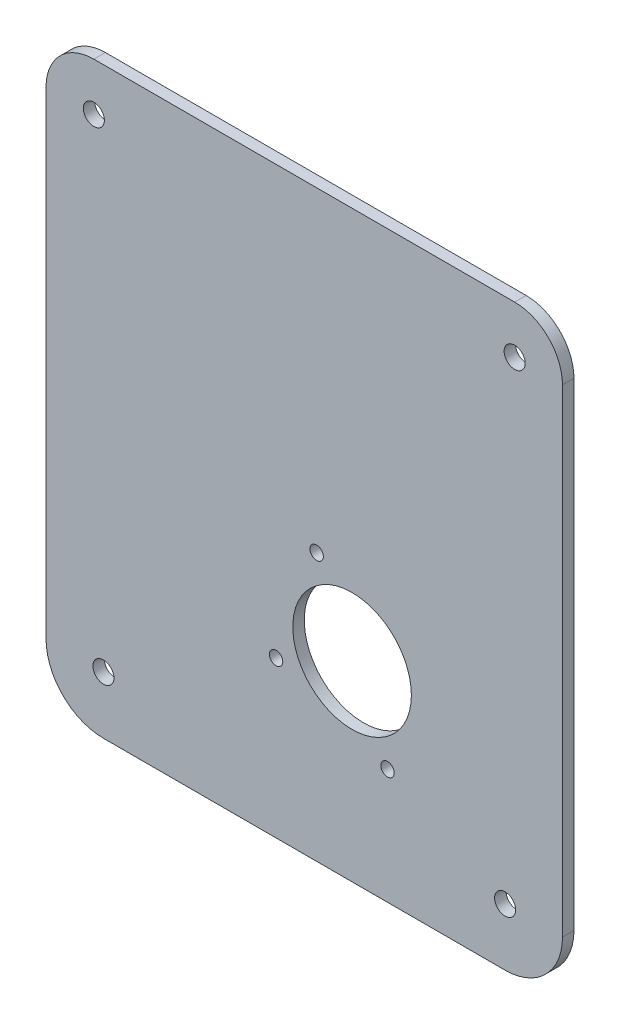
ISO-10303-21;
HEADER;
FILE_DESCRIPTION(('STEP AP214'),'2;1');
FILE_NAME('part.step','',(''),(''),'','','');
FILE_SCHEMA(('AUTOMOTIVE_DESIGN { 1 0 10303 214 1 1 1 1 }'));
ENDSEC;
DATA;
#1=APPLICATION_CONTEXT('core data for automotive mechanical design processes');
#2=APPLICATION_PROTOCOL_DEFINITION('international standard','automotive_design',2000,#1);
#3=PRODUCT_CONTEXT('',#1,'mechanical');
#4=PRODUCT('Part','Part','',(#3));
#5=PRODUCT_RELATED_PRODUCT_CATEGORY('part','',(#4));
#6=PRODUCT_DEFINITION_FORMATION('','',#4);
#7=PRODUCT_DEFINITION_CONTEXT('part definition',#1,'design');
#8=PRODUCT_DEFINITION('design','',#6,#7);
#9=PRODUCT_DEFINITION_SHAPE('','',#8);
#10=(LENGTH_UNIT() NAMED_UNIT(*) SI_UNIT(.MILLI.,.METRE.));
#11=(NAMED_UNIT(*) PLANE_ANGLE_UNIT() SI_UNIT($,.RADIAN.));
#12=(NAMED_UNIT(*) SI_UNIT($,.STERADIAN.) SOLID_ANGLE_UNIT());
#13=UNCERTAINTY_MEASURE_WITH_UNIT(LENGTH_MEASURE(1.E-05),#10,'distance_accuracy_value','');
#14=(GEOMETRIC_REPRESENTATION_CONTEXT(3) GLOBAL_UNCERTAINTY_ASSIGNED_CONTEXT((#13)) GLOBAL_UNIT_ASSIGNED_CONTEXT((#10,
#11,#12)) REPRESENTATION_CONTEXT('',''));
#15=CARTESIAN_POINT('',(0.,0.,0.));
#16=DIRECTION('',(0.,0.,1.));
#17=DIRECTION('',(1.,0.,0.));
#18=AXIS2_PLACEMENT_3D('',#15,#16,#17);
#19=CARTESIAN_POINT('',(-67.5,90.,3.));
#20=DIRECTION('',(0.,0.,1.));
#21=DIRECTION('',(1.,0.,0.));
#22=AXIS2_PLACEMENT_3D('',#19,#20,#21);
#23=PLANE('',#22);
#24=CARTESIAN_POINT('',(42.5,90.,3.));
#25=DIRECTION('',(0.,0.,-1.));
#26=DIRECTION('',(-1.,0.,0.));
#27=AXIS2_PLACEMENT_3D('',#24,#25,#26);
#28=CIRCLE('',#27,2.75);
#29=CARTESIAN_POINT('',(39.75,90.,3.));
#30=VERTEX_POINT('',#29);
#31=EDGE_CURVE('E195',#30,#30,#28,.T.);
#32=ORIENTED_EDGE('',*,*,#31,.T.);
#33=EDGE_LOOP('',(#32));
#34=FACE_BOUND('',#33,.T.);
#35=CARTESIAN_POINT('',(9.2639234006337,-19.8665478437295,3.));
#36=DIRECTION('',(0.,0.,1.));
#37=DIRECTION('',(1.,0.,0.));
#38=AXIS2_PLACEMENT_3D('',#35,#36,#37);
#39=CIRCLE('',#38,1.75);
#40=CARTESIAN_POINT('',(11.0139234006337,-19.8665478437295,3.));
#41=VERTEX_POINT('',#40);
#42=EDGE_CURVE('E191',#41,#41,#39,.T.);
#43=ORIENTED_EDGE('',*,*,#42,.F.);
#44=EDGE_LOOP('',(#43));
#45=FACE_BOUND('',#44,.T.);
#46=CARTESIAN_POINT('',(-9.2639234006337,19.8665478437294,3.));
#47=DIRECTION('',(0.,0.,1.));
#48=DIRECTION('',(1.,0.,0.));
#49=AXIS2_PLACEMENT_3D('',#46,#47,#48);
#50=CIRCLE('',#49,1.75);
#51=CARTESIAN_POINT('',(-7.5139234006337,19.8665478437294,3.));
#52=VERTEX_POINT('',#51);
#53=EDGE_CURVE('E198',#52,#52,#50,.T.);
#54=ORIENTED_EDGE('',*,*,#53,.F.);
#55=EDGE_LOOP('',(#54));
#56=FACE_BOUND('',#55,.T.);
#57=CARTESIAN_POINT('',(-19.8665478437295,-9.2639234006337,3.));
#58=DIRECTION('',(0.,0.,1.));
#59=DIRECTION('',(1.,0.,0.));
#60=AXIS2_PLACEMENT_3D('',#57,#58,#59);
#61=CIRCLE('',#60,1.75);
#62=CARTESIAN_POINT('',(-18.1165478437295,-9.2639234006337,3.));
#63=VERTEX_POINT('',#62);
#64=EDGE_CURVE('E204',#63,#63,#61,.T.);
#65=ORIENTED_EDGE('',*,*,#64,.F.);
#66=EDGE_LOOP('',(#65));
#67=FACE_BOUND('',#66,.T.);
#68=CARTESIAN_POINT('',(0.,0.,3.));
#69=DIRECTION('',(0.,0.,1.));
#70=DIRECTION('',(1.,0.,0.));
#71=AXIS2_PLACEMENT_3D('',#68,#69,#70);
#72=CIRCLE('',#71,15.5);
#73=CARTESIAN_POINT('',(15.5,0.,3.));
#74=VERTEX_POINT('',#73);
#75=EDGE_CURVE('E185',#74,#74,#72,.T.);
#76=ORIENTED_EDGE('',*,*,#75,.F.);
#77=EDGE_LOOP('',(#76));
#78=FACE_BOUND('',#77,.T.);
#79=CARTESIAN_POINT('',(-67.5,90.,3.));
#80=DIRECTION('',(0.,0.,1.));
#81=DIRECTION('',(1.,0.,0.));
#82=AXIS2_PLACEMENT_3D('',#79,#80,#81);
#83=CIRCLE('',#82,12.5);
#84=CARTESIAN_POINT('',(-67.5,102.5,3.));
#85=VERTEX_POINT('',#84);
#86=CARTESIAN_POINT('',(-80.,90.,3.));
#87=VERTEX_POINT('',#86);
#88=EDGE_CURVE('E151',#85,#87,#83,.T.);
#89=ORIENTED_EDGE('',*,*,#88,.T.);
#90=DIRECTION('',(0.,-1.,0.));
#91=VECTOR('',#90,1.);
#92=CARTESIAN_POINT('',(-80.,-35.,3.));
#93=LINE('',#92,#91);
#94=CARTESIAN_POINT('',(-80.,-35.,3.));
#95=VERTEX_POINT('',#94);
#96=EDGE_CURVE('E99',#87,#95,#93,.T.);
#97=ORIENTED_EDGE('',*,*,#96,.T.);
#98=CARTESIAN_POINT('',(-65.,-35.,3.));
#99=DIRECTION('',(0.,0.,1.));
#100=DIRECTION('',(-1.,0.,0.));
#101=AXIS2_PLACEMENT_3D('',#98,#99,#100);
#102=CIRCLE('',#101,15.);
#103=CARTESIAN_POINT('',(-65.,-50.,3.));
#104=VERTEX_POINT('',#103);
#105=EDGE_CURVE('E166',#95,#104,#102,.T.);
#106=ORIENTED_EDGE('',*,*,#105,.T.);
#107=DIRECTION('',(1.,0.,0.));
#108=VECTOR('',#107,1.);
#109=CARTESIAN_POINT('',(40.,-50.,3.));
#110=LINE('',#109,#108);
#111=CARTESIAN_POINT('',(40.,-50.,3.));
#112=VERTEX_POINT('',#111);
#113=EDGE_CURVE('E179',#104,#112,#110,.T.);
#114=ORIENTED_EDGE('',*,*,#113,.T.);
#115=CARTESIAN_POINT('',(40.,-35.,3.));
#116=DIRECTION('',(0.,0.,1.));
#117=DIRECTION('',(-1.,0.,0.));
#118=AXIS2_PLACEMENT_3D('',#115,#116,#117);
#119=CIRCLE('',#118,15.);
#120=CARTESIAN_POINT('',(55.,-35.,3.));
#121=VERTEX_POINT('',#120);
#122=EDGE_CURVE('E118',#112,#121,#119,.T.);
#123=ORIENTED_EDGE('',*,*,#122,.T.);
#124=DIRECTION('',(0.,1.,0.));
#125=VECTOR('',#124,1.);
#126=CARTESIAN_POINT('',(55.,90.,3.));
#127=LINE('',#126,#125);
#128=CARTESIAN_POINT('',(55.,90.,3.));
#129=VERTEX_POINT('',#128);
#130=EDGE_CURVE('E112',#121,#129,#127,.T.);
#131=ORIENTED_EDGE('',*,*,#130,.T.);
#132=CARTESIAN_POINT('',(42.5,90.,3.));
#133=DIRECTION('',(0.,0.,1.));
#134=DIRECTION('',(-1.,0.,0.));
#135=AXIS2_PLACEMENT_3D('',#132,#133,#134);
#136=CIRCLE('',#135,12.5);
#137=CARTESIAN_POINT('',(42.5,102.5,3.));
#138=VERTEX_POINT('',#137);
#139=EDGE_CURVE('E116',#129,#138,#136,.T.);
#140=ORIENTED_EDGE('',*,*,#139,.T.);
#141=DIRECTION('',(-1.,0.,0.));
#142=VECTOR('',#141,1.);
#143=CARTESIAN_POINT('',(-67.5,102.5,3.));
#144=LINE('',#143,#142);
#145=EDGE_CURVE('E56',#138,#85,#144,.T.);
#146=ORIENTED_EDGE('',*,*,#145,.T.);
#147=EDGE_LOOP('',(#89,#97,#106,#114,#123,#131,#140,#146));
#148=FACE_BOUND('',#147,.T.);
#149=CARTESIAN_POINT('',(-65.,-35.,3.));
#150=DIRECTION('',(0.,0.,-1.));
#151=DIRECTION('',(-1.,0.,0.));
#152=AXIS2_PLACEMENT_3D('',#149,#150,#151);
#153=CIRCLE('',#152,2.75);
#154=CARTESIAN_POINT('',(-67.75,-35.,3.));
#155=VERTEX_POINT('',#154);
#156=EDGE_CURVE('E214',#155,#155,#153,.T.);
#157=ORIENTED_EDGE('',*,*,#156,.T.);
#158=EDGE_LOOP('',(#157));
#159=FACE_BOUND('',#158,.T.);
#160=CARTESIAN_POINT('',(-67.5,90.,3.));
#161=DIRECTION('',(0.,0.,-1.));
#162=DIRECTION('',(-1.,0.,0.));
#163=AXIS2_PLACEMENT_3D('',#160,#161,#162);
#164=CIRCLE('',#163,2.75);
#165=CARTESIAN_POINT('',(-70.25,90.,3.));
#166=VERTEX_POINT('',#165);
#167=EDGE_CURVE('E220',#166,#166,#164,.T.);
#168=ORIENTED_EDGE('',*,*,#167,.T.);
#169=EDGE_LOOP('',(#168));
#170=FACE_BOUND('',#169,.T.);
#171=CARTESIAN_POINT('',(40.,-35.,3.));
#172=DIRECTION('',(0.,0.,-1.));
#173=DIRECTION('',(-1.,0.,0.));
#174=AXIS2_PLACEMENT_3D('',#171,#172,#173);
#175=CIRCLE('',#174,2.75);
#176=CARTESIAN_POINT('',(37.25,-35.,3.));
#177=VERTEX_POINT('',#176);
#178=EDGE_CURVE('E226',#177,#177,#175,.T.);
#179=ORIENTED_EDGE('',*,*,#178,.T.);
#180=EDGE_LOOP('',(#179));
#181=FACE_BOUND('',#180,.T.);
#182=ADVANCED_FACE('F39',(#34,#45,#56,#67,#78,#148,#159,#170,#181),#23,.T.);
#183=CARTESIAN_POINT('',(-67.5,90.,0.));
#184=DIRECTION('',(0.,0.,1.));
#185=DIRECTION('',(1.,0.,0.));
#186=AXIS2_PLACEMENT_3D('',#183,#184,#185);
#187=PLANE('',#186);
#188=CARTESIAN_POINT('',(-67.5,90.,0.));
#189=DIRECTION('',(0.,0.,-1.));
#190=DIRECTION('',(-1.,0.,0.));
#191=AXIS2_PLACEMENT_3D('',#188,#189,#190);
#192=CIRCLE('',#191,2.74999999999999);
#193=CARTESIAN_POINT('',(-70.25,90.,0.));
#194=VERTEX_POINT('',#193);
#195=EDGE_CURVE('E223',#194,#194,#192,.T.);
#196=ORIENTED_EDGE('',*,*,#195,.F.);
#197=EDGE_LOOP('',(#196));
#198=FACE_BOUND('',#197,.T.);
#199=CARTESIAN_POINT('',(-65.,-35.,0.));
#200=DIRECTION('',(0.,0.,-1.));
#201=DIRECTION('',(-1.,0.,0.));
#202=AXIS2_PLACEMENT_3D('',#199,#200,#201);
#203=CIRCLE('',#202,2.74999999999999);
#204=CARTESIAN_POINT('',(-67.75,-35.,0.));
#205=VERTEX_POINT('',#204);
#206=EDGE_CURVE('E217',#205,#205,#203,.T.);
#207=ORIENTED_EDGE('',*,*,#206,.F.);
#208=EDGE_LOOP('',(#207));
#209=FACE_BOUND('',#208,.T.);
#210=CARTESIAN_POINT('',(9.2639234006337,-19.8665478437295,0.));
#211=DIRECTION('',(0.,0.,1.));
#212=DIRECTION('',(1.,0.,0.));
#213=AXIS2_PLACEMENT_3D('',#210,#211,#212);
#214=CIRCLE('',#213,1.75);
#215=CARTESIAN_POINT('',(11.0139234006337,-19.8665478437295,0.));
#216=VERTEX_POINT('',#215);
#217=EDGE_CURVE('E194',#216,#216,#214,.T.);
#218=ORIENTED_EDGE('',*,*,#217,.T.);
#219=EDGE_LOOP('',(#218));
#220=FACE_BOUND('',#219,.T.);
#221=CARTESIAN_POINT('',(-9.2639234006337,19.8665478437294,0.));
#222=DIRECTION('',(0.,0.,1.));
#223=DIRECTION('',(1.,0.,0.));
#224=AXIS2_PLACEMENT_3D('',#221,#222,#223);
#225=CIRCLE('',#224,1.75);
#226=CARTESIAN_POINT('',(-7.5139234006337,19.8665478437294,0.));
#227=VERTEX_POINT('',#226);
#228=EDGE_CURVE('E201',#227,#227,#225,.T.);
#229=ORIENTED_EDGE('',*,*,#228,.T.);
#230=EDGE_LOOP('',(#229));
#231=FACE_BOUND('',#230,.T.);
#232=CARTESIAN_POINT('',(-19.8665478437295,-9.2639234006337,0.));
#233=DIRECTION('',(0.,0.,1.));
#234=DIRECTION('',(1.,0.,0.));
#235=AXIS2_PLACEMENT_3D('',#232,#233,#234);
#236=CIRCLE('',#235,1.75);
#237=CARTESIAN_POINT('',(-18.1165478437295,-9.2639234006337,0.));
#238=VERTEX_POINT('',#237);
#239=EDGE_CURVE('E188',#238,#238,#236,.T.);
#240=ORIENTED_EDGE('',*,*,#239,.T.);
#241=EDGE_LOOP('',(#240));
#242=FACE_BOUND('',#241,.T.);
#243=CARTESIAN_POINT('',(0.,0.,0.));
#244=DIRECTION('',(0.,0.,1.));
#245=DIRECTION('',(1.,0.,0.));
#246=AXIS2_PLACEMENT_3D('',#243,#244,#245);
#247=CIRCLE('',#246,15.5);
#248=CARTESIAN_POINT('',(15.5,0.,0.));
#249=VERTEX_POINT('',#248);
#250=EDGE_CURVE('E140',#249,#249,#247,.T.);
#251=ORIENTED_EDGE('',*,*,#250,.T.);
#252=EDGE_LOOP('',(#251));
#253=FACE_BOUND('',#252,.T.);
#254=CARTESIAN_POINT('',(-67.5,90.,0.));
#255=DIRECTION('',(0.,0.,1.));
#256=DIRECTION('',(1.,0.,0.));
#257=AXIS2_PLACEMENT_3D('',#254,#255,#256);
#258=CIRCLE('',#257,12.5);
#259=CARTESIAN_POINT('',(-67.5,102.5,0.));
#260=VERTEX_POINT('',#259);
#261=CARTESIAN_POINT('',(-80.,90.,0.));
#262=VERTEX_POINT('',#261);
#263=EDGE_CURVE('E136',#260,#262,#258,.T.);
#264=ORIENTED_EDGE('',*,*,#263,.F.);
#265=DIRECTION('',(-1.,0.,0.));
#266=VECTOR('',#265,1.);
#267=CARTESIAN_POINT('',(-67.5,102.5,0.));
#268=LINE('',#267,#266);
#269=CARTESIAN_POINT('',(42.5,102.5,0.));
#270=VERTEX_POINT('',#269);
#271=EDGE_CURVE('E91',#270,#260,#268,.T.);
#272=ORIENTED_EDGE('',*,*,#271,.F.);
#273=CARTESIAN_POINT('',(42.5,90.,0.));
#274=DIRECTION('',(0.,0.,1.));
#275=DIRECTION('',(-1.,0.,0.));
#276=AXIS2_PLACEMENT_3D('',#273,#274,#275);
#277=CIRCLE('',#276,12.5);
#278=CARTESIAN_POINT('',(55.,90.,0.));
#279=VERTEX_POINT('',#278);
#280=EDGE_CURVE('E85',#279,#270,#277,.T.);
#281=ORIENTED_EDGE('',*,*,#280,.F.);
#282=DIRECTION('',(0.,1.,0.));
#283=VECTOR('',#282,1.);
#284=CARTESIAN_POINT('',(55.,90.,0.));
#285=LINE('',#284,#283);
#286=CARTESIAN_POINT('',(55.,-35.,0.));
#287=VERTEX_POINT('',#286);
#288=EDGE_CURVE('E126',#287,#279,#285,.T.);
#289=ORIENTED_EDGE('',*,*,#288,.F.);
#290=CARTESIAN_POINT('',(40.,-35.,0.));
#291=DIRECTION('',(0.,0.,1.));
#292=DIRECTION('',(-1.,0.,0.));
#293=AXIS2_PLACEMENT_3D('',#290,#291,#292);
#294=CIRCLE('',#293,15.);
#295=CARTESIAN_POINT('',(40.,-50.,0.));
#296=VERTEX_POINT('',#295);
#297=EDGE_CURVE('E146',#296,#287,#294,.T.);
#298=ORIENTED_EDGE('',*,*,#297,.F.);
#299=DIRECTION('',(1.,0.,0.));
#300=VECTOR('',#299,1.);
#301=CARTESIAN_POINT('',(40.,-50.,0.));
#302=LINE('',#301,#300);
#303=CARTESIAN_POINT('',(-65.,-50.,0.));
#304=VERTEX_POINT('',#303);
#305=EDGE_CURVE('E144',#304,#296,#302,.T.);
#306=ORIENTED_EDGE('',*,*,#305,.F.);
#307=CARTESIAN_POINT('',(-65.,-35.,0.));
#308=DIRECTION('',(0.,0.,1.));
#309=DIRECTION('',(-1.,0.,0.));
#310=AXIS2_PLACEMENT_3D('',#307,#308,#309);
#311=CIRCLE('',#310,15.);
#312=CARTESIAN_POINT('',(-80.,-35.,0.));
#313=VERTEX_POINT('',#312);
#314=EDGE_CURVE('E142',#313,#304,#311,.T.);
#315=ORIENTED_EDGE('',*,*,#314,.F.);
#316=DIRECTION('',(0.,-1.,0.));
#317=VECTOR('',#316,1.);
#318=CARTESIAN_POINT('',(-80.,-35.,0.));
#319=LINE('',#318,#317);
#320=EDGE_CURVE('E139',#262,#313,#319,.T.);
#321=ORIENTED_EDGE('',*,*,#320,.F.);
#322=EDGE_LOOP('',(#264,#272,#281,#289,#298,#306,#315,#321));
#323=FACE_BOUND('',#322,.T.);
#324=CARTESIAN_POINT('',(42.5,90.,0.));
#325=DIRECTION('',(0.,0.,-1.));
#326=DIRECTION('',(-1.,0.,0.));
#327=AXIS2_PLACEMENT_3D('',#324,#325,#326);
#328=CIRCLE('',#327,2.74999999999999);
#329=CARTESIAN_POINT('',(39.75,90.,0.));
#330=VERTEX_POINT('',#329);
#331=EDGE_CURVE('E211',#330,#330,#328,.T.);
#332=ORIENTED_EDGE('',*,*,#331,.F.);
#333=EDGE_LOOP('',(#332));
#334=FACE_BOUND('',#333,.T.);
#335=CARTESIAN_POINT('',(40.,-35.,0.));
#336=DIRECTION('',(0.,0.,-1.));
#337=DIRECTION('',(-1.,0.,0.));
#338=AXIS2_PLACEMENT_3D('',#335,#336,#337);
#339=CIRCLE('',#338,2.74999999999999);
#340=CARTESIAN_POINT('',(37.25,-35.,0.));
#341=VERTEX_POINT('',#340);
#342=EDGE_CURVE('E229',#341,#341,#339,.T.);
#343=ORIENTED_EDGE('',*,*,#342,.F.);
#344=EDGE_LOOP('',(#343));
#345=FACE_BOUND('',#344,.T.);
#346=ADVANCED_FACE('F170',(#198,#209,#220,#231,#242,#253,#323,#334,#345),#187,.F.);
#347=CARTESIAN_POINT('',(-67.5,90.,3.));
#348=DIRECTION('',(0.,0.,-1.));
#349=DIRECTION('',(-1.,0.,0.));
#350=AXIS2_PLACEMENT_3D('',#347,#348,#349);
#351=CYLINDRICAL_SURFACE('',#350,12.5);
#352=ORIENTED_EDGE('',*,*,#263,.T.);
#353=DIRECTION('',(0.,0.,-1.));
#354=VECTOR('',#353,1.);
#355=CARTESIAN_POINT('',(-80.,90.,3.));
#356=LINE('',#355,#354);
#357=EDGE_CURVE('E11',#87,#262,#356,.T.);
#358=ORIENTED_EDGE('',*,*,#357,.F.);
#359=ORIENTED_EDGE('',*,*,#88,.F.);
#360=DIRECTION('',(0.,0.,-1.));
#361=VECTOR('',#360,1.);
#362=CARTESIAN_POINT('',(-67.5,102.5,3.));
#363=LINE('',#362,#361);
#364=EDGE_CURVE('E132',#85,#260,#363,.T.);
#365=ORIENTED_EDGE('',*,*,#364,.T.);
#366=EDGE_LOOP('',(#352,#358,#359,#365));
#367=FACE_BOUND('',#366,.T.);
#368=ADVANCED_FACE('F41',(#367),#351,.T.);
#369=CARTESIAN_POINT('',(-80.,-35.,3.));
#370=DIRECTION('',(1.,0.,0.));
#371=DIRECTION('',(0.,0.,-1.));
#372=AXIS2_PLACEMENT_3D('',#369,#370,#371);
#373=PLANE('',#372);
#374=ORIENTED_EDGE('',*,*,#320,.T.);
#375=DIRECTION('',(0.,0.,-1.));
#376=VECTOR('',#375,1.);
#377=CARTESIAN_POINT('',(-80.,-35.,3.));
#378=LINE('',#377,#376);
#379=EDGE_CURVE('E48',#95,#313,#378,.T.);
#380=ORIENTED_EDGE('',*,*,#379,.F.);
#381=ORIENTED_EDGE('',*,*,#96,.F.);
#382=ORIENTED_EDGE('',*,*,#357,.T.);
#383=EDGE_LOOP('',(#374,#380,#381,#382));
#384=FACE_BOUND('',#383,.T.);
#385=ADVANCED_FACE('F242',(#384),#373,.F.);
#386=CARTESIAN_POINT('',(-65.,-35.,3.));
#387=DIRECTION('',(0.,0.,-1.));
#388=DIRECTION('',(-1.,0.,0.));
#389=AXIS2_PLACEMENT_3D('',#386,#387,#388);
#390=CYLINDRICAL_SURFACE('',#389,15.);
#391=ORIENTED_EDGE('',*,*,#314,.T.);
#392=DIRECTION('',(0.,0.,-1.));
#393=VECTOR('',#392,1.);
#394=CARTESIAN_POINT('',(-65.,-50.,3.));
#395=LINE('',#394,#393);
#396=EDGE_CURVE('E158',#104,#304,#395,.T.);
#397=ORIENTED_EDGE('',*,*,#396,.F.);
#398=ORIENTED_EDGE('',*,*,#105,.F.);
#399=ORIENTED_EDGE('',*,*,#379,.T.);
#400=EDGE_LOOP('',(#391,#397,#398,#399));
#401=FACE_BOUND('',#400,.T.);
#402=ADVANCED_FACE('F164',(#401),#390,.T.);
#403=CARTESIAN_POINT('',(40.,-50.,3.));
#404=DIRECTION('',(0.,1.,0.));
#405=DIRECTION('',(-1.,0.,0.));
#406=AXIS2_PLACEMENT_3D('',#403,#404,#405);
#407=PLANE('',#406);
#408=ORIENTED_EDGE('',*,*,#305,.T.);
#409=DIRECTION('',(0.,0.,-1.));
#410=VECTOR('',#409,1.);
#411=CARTESIAN_POINT('',(40.,-50.,3.));
#412=LINE('',#411,#410);
#413=EDGE_CURVE('E155',#112,#296,#412,.T.);
#414=ORIENTED_EDGE('',*,*,#413,.F.);
#415=ORIENTED_EDGE('',*,*,#113,.F.);
#416=ORIENTED_EDGE('',*,*,#396,.T.);
#417=EDGE_LOOP('',(#408,#414,#415,#416));
#418=FACE_BOUND('',#417,.T.);
#419=ADVANCED_FACE('F175',(#418),#407,.F.);
#420=CARTESIAN_POINT('',(40.,-35.,3.));
#421=DIRECTION('',(0.,0.,-1.));
#422=DIRECTION('',(-1.,0.,0.));
#423=AXIS2_PLACEMENT_3D('',#420,#421,#422);
#424=CYLINDRICAL_SURFACE('',#423,15.);
#425=ORIENTED_EDGE('',*,*,#297,.T.);
#426=DIRECTION('',(0.,0.,-1.));
#427=VECTOR('',#426,1.);
#428=CARTESIAN_POINT('',(55.,-35.,3.));
#429=LINE('',#428,#427);
#430=EDGE_CURVE('E127',#121,#287,#429,.T.);
#431=ORIENTED_EDGE('',*,*,#430,.F.);
#432=ORIENTED_EDGE('',*,*,#122,.F.);
#433=ORIENTED_EDGE('',*,*,#413,.T.);
#434=EDGE_LOOP('',(#425,#431,#432,#433));
#435=FACE_BOUND('',#434,.T.);
#436=ADVANCED_FACE('F178',(#435),#424,.T.);
#437=CARTESIAN_POINT('',(55.,90.,3.));
#438=DIRECTION('',(-1.,0.,0.));
#439=DIRECTION('',(0.,-1.,0.));
#440=AXIS2_PLACEMENT_3D('',#437,#438,#439);
#441=PLANE('',#440);
#442=ORIENTED_EDGE('',*,*,#288,.T.);
#443=DIRECTION('',(0.,0.,-1.));
#444=VECTOR('',#443,1.);
#445=CARTESIAN_POINT('',(55.,90.,3.));
#446=LINE('',#445,#444);
#447=EDGE_CURVE('E123',#129,#279,#446,.T.);
#448=ORIENTED_EDGE('',*,*,#447,.F.);
#449=ORIENTED_EDGE('',*,*,#130,.F.);
#450=ORIENTED_EDGE('',*,*,#430,.T.);
#451=EDGE_LOOP('',(#442,#448,#449,#450));
#452=FACE_BOUND('',#451,.T.);
#453=ADVANCED_FACE('F124',(#452),#441,.F.);
#454=CARTESIAN_POINT('',(42.5,90.,3.));
#455=DIRECTION('',(0.,0.,-1.));
#456=DIRECTION('',(-1.,0.,0.));
#457=AXIS2_PLACEMENT_3D('',#454,#455,#456);
#458=CYLINDRICAL_SURFACE('',#457,12.5);
#459=ORIENTED_EDGE('',*,*,#280,.T.);
#460=DIRECTION('',(0.,0.,-1.));
#461=VECTOR('',#460,1.);
#462=CARTESIAN_POINT('',(42.5,102.5,3.));
#463=LINE('',#462,#461);
#464=EDGE_CURVE('E128',#138,#270,#463,.T.);
#465=ORIENTED_EDGE('',*,*,#464,.F.);
#466=ORIENTED_EDGE('',*,*,#139,.F.);
#467=ORIENTED_EDGE('',*,*,#447,.T.);
#468=EDGE_LOOP('',(#459,#465,#466,#467));
#469=FACE_BOUND('',#468,.T.);
#470=ADVANCED_FACE('F130',(#469),#458,.T.);
#471=CARTESIAN_POINT('',(-67.5,102.5,3.));
#472=DIRECTION('',(0.,-1.,0.));
#473=DIRECTION('',(1.,0.,0.));
#474=AXIS2_PLACEMENT_3D('',#471,#472,#473);
#475=PLANE('',#474);
#476=ORIENTED_EDGE('',*,*,#271,.T.);
#477=ORIENTED_EDGE('',*,*,#364,.F.);
#478=ORIENTED_EDGE('',*,*,#145,.F.);
#479=ORIENTED_EDGE('',*,*,#464,.T.);
#480=EDGE_LOOP('',(#476,#477,#478,#479));
#481=FACE_BOUND('',#480,.T.);
#482=ADVANCED_FACE('F250',(#481),#475,.F.);
#483=CARTESIAN_POINT('',(0.,0.,0.));
#484=DIRECTION('',(0.,0.,1.));
#485=DIRECTION('',(1.,0.,0.));
#486=AXIS2_PLACEMENT_3D('',#483,#484,#485);
#487=CYLINDRICAL_SURFACE('',#486,15.5);
#488=ORIENTED_EDGE('',*,*,#250,.F.);
#489=EDGE_LOOP('',(#488));
#490=FACE_BOUND('',#489,.T.);
#491=ORIENTED_EDGE('',*,*,#75,.T.);
#492=EDGE_LOOP('',(#491));
#493=FACE_BOUND('',#492,.T.);
#494=ADVANCED_FACE('F253',(#490,#493),#487,.F.);
#495=CARTESIAN_POINT('',(-19.8665478437295,-9.2639234006337,0.));
#496=DIRECTION('',(0.,0.,1.));
#497=DIRECTION('',(1.,0.,0.));
#498=AXIS2_PLACEMENT_3D('',#495,#496,#497);
#499=CYLINDRICAL_SURFACE('',#498,1.75);
#500=ORIENTED_EDGE('',*,*,#239,.F.);
#501=EDGE_LOOP('',(#500));
#502=FACE_BOUND('',#501,.T.);
#503=ORIENTED_EDGE('',*,*,#64,.T.);
#504=EDGE_LOOP('',(#503));
#505=FACE_BOUND('',#504,.T.);
#506=ADVANCED_FACE('F300',(#502,#505),#499,.F.);
#507=CARTESIAN_POINT('',(-9.2639234006337,19.8665478437294,0.));
#508=DIRECTION('',(0.,0.,1.));
#509=DIRECTION('',(1.,0.,0.));
#510=AXIS2_PLACEMENT_3D('',#507,#508,#509);
#511=CYLINDRICAL_SURFACE('',#510,1.75);
#512=ORIENTED_EDGE('',*,*,#228,.F.);
#513=EDGE_LOOP('',(#512));
#514=FACE_BOUND('',#513,.T.);
#515=ORIENTED_EDGE('',*,*,#53,.T.);
#516=EDGE_LOOP('',(#515));
#517=FACE_BOUND('',#516,.T.);
#518=ADVANCED_FACE('F307',(#514,#517),#511,.F.);
#519=CARTESIAN_POINT('',(9.2639234006337,-19.8665478437295,0.));
#520=DIRECTION('',(0.,0.,1.));
#521=DIRECTION('',(1.,0.,0.));
#522=AXIS2_PLACEMENT_3D('',#519,#520,#521);
#523=CYLINDRICAL_SURFACE('',#522,1.75);
#524=ORIENTED_EDGE('',*,*,#217,.F.);
#525=EDGE_LOOP('',(#524));
#526=FACE_BOUND('',#525,.T.);
#527=ORIENTED_EDGE('',*,*,#42,.T.);
#528=EDGE_LOOP('',(#527));
#529=FACE_BOUND('',#528,.T.);
#530=ADVANCED_FACE('F315',(#526,#529),#523,.F.);
#531=CARTESIAN_POINT('',(42.5,90.,0.));
#532=DIRECTION('',(0.,0.,-1.));
#533=DIRECTION('',(-1.,0.,0.));
#534=AXIS2_PLACEMENT_3D('',#531,#532,#533);
#535=CYLINDRICAL_SURFACE('',#534,2.75);
#536=ORIENTED_EDGE('',*,*,#31,.F.);
#537=EDGE_LOOP('',(#536));
#538=FACE_BOUND('',#537,.T.);
#539=ORIENTED_EDGE('',*,*,#331,.T.);
#540=EDGE_LOOP('',(#539));
#541=FACE_BOUND('',#540,.T.);
#542=ADVANCED_FACE('F323',(#538,#541),#535,.F.);
#543=CARTESIAN_POINT('',(-65.,-35.,0.));
#544=DIRECTION('',(0.,0.,-1.));
#545=DIRECTION('',(-1.,0.,0.));
#546=AXIS2_PLACEMENT_3D('',#543,#544,#545);
#547=CYLINDRICAL_SURFACE('',#546,2.75);
#548=ORIENTED_EDGE('',*,*,#156,.F.);
#549=EDGE_LOOP('',(#548));
#550=FACE_BOUND('',#549,.T.);
#551=ORIENTED_EDGE('',*,*,#206,.T.);
#552=EDGE_LOOP('',(#551));
#553=FACE_BOUND('',#552,.T.);
#554=ADVANCED_FACE('F332',(#550,#553),#547,.F.);
#555=CARTESIAN_POINT('',(-67.5,90.,0.));
#556=DIRECTION('',(0.,0.,-1.));
#557=DIRECTION('',(-1.,0.,0.));
#558=AXIS2_PLACEMENT_3D('',#555,#556,#557);
#559=CYLINDRICAL_SURFACE('',#558,2.75);
#560=ORIENTED_EDGE('',*,*,#167,.F.);
#561=EDGE_LOOP('',(#560));
#562=FACE_BOUND('',#561,.T.);
#563=ORIENTED_EDGE('',*,*,#195,.T.);
#564=EDGE_LOOP('',(#563));
#565=FACE_BOUND('',#564,.T.);
#566=ADVANCED_FACE('F340',(#562,#565),#559,.F.);
#567=CARTESIAN_POINT('',(40.,-35.,0.));
#568=DIRECTION('',(0.,0.,-1.));
#569=DIRECTION('',(-1.,0.,0.));
#570=AXIS2_PLACEMENT_3D('',#567,#568,#569);
#571=CYLINDRICAL_SURFACE('',#570,2.75);
#572=ORIENTED_EDGE('',*,*,#178,.F.);
#573=EDGE_LOOP('',(#572));
#574=FACE_BOUND('',#573,.T.);
#575=ORIENTED_EDGE('',*,*,#342,.T.);
#576=EDGE_LOOP('',(#575));
#577=FACE_BOUND('',#576,.T.);
#578=ADVANCED_FACE('F233',(#574,#577),#571,.F.);
#579=CLOSED_SHELL('',(#182,#346,#368,#385,#402,#419,#436,#453,#470,#482,#494,#506,#518,#530,
#542,#554,#566,#578));
#580=MANIFOLD_SOLID_BREP('B2',#579);
#581=ADVANCED_BREP_SHAPE_REPRESENTATION('',(#18,#580),#14);
#582=SHAPE_DEFINITION_REPRESENTATION(#9,#581);
ENDSEC;
END-ISO-10303-21;
